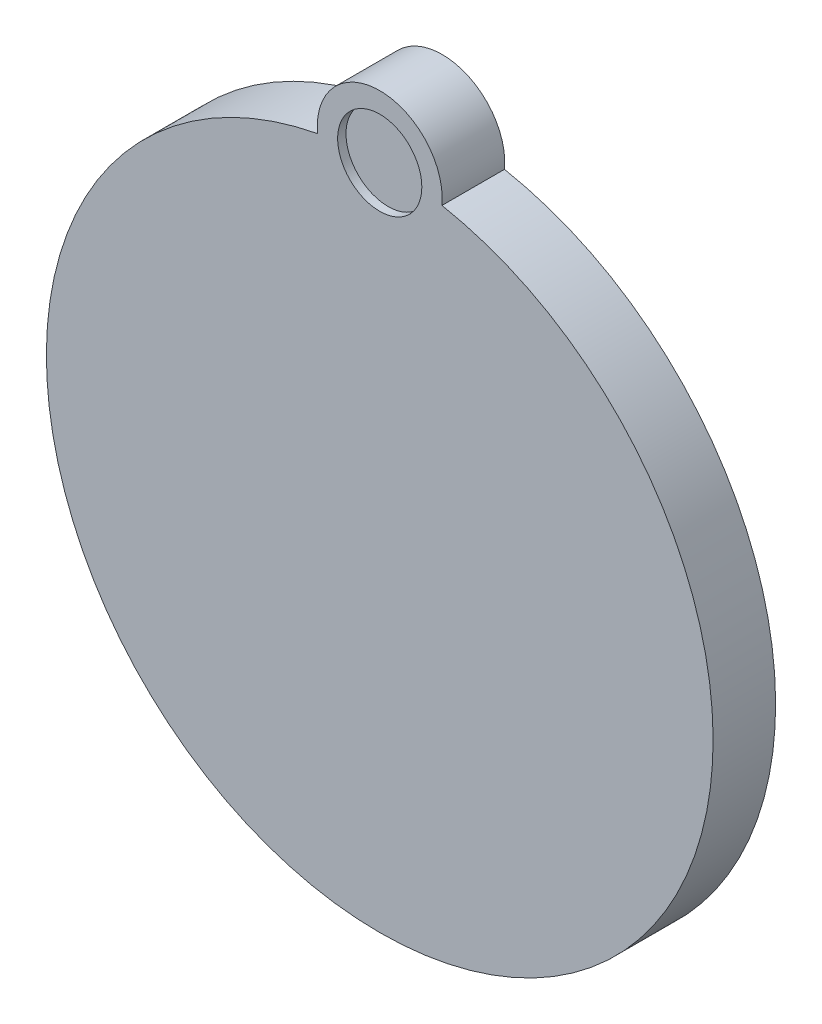
ISO-10303-21;
HEADER;
FILE_DESCRIPTION(('STEP AP214'),'2;1');
FILE_NAME('part.step','',(''),(''),'','','');
FILE_SCHEMA(('AUTOMOTIVE_DESIGN { 1 0 10303 214 1 1 1 1 }'));
ENDSEC;
DATA;
#1=APPLICATION_CONTEXT('core data for automotive mechanical design processes');
#2=APPLICATION_PROTOCOL_DEFINITION('international standard','automotive_design',2000,#1);
#3=PRODUCT_CONTEXT('',#1,'mechanical');
#4=PRODUCT('Part','Part','',(#3));
#5=PRODUCT_RELATED_PRODUCT_CATEGORY('part','',(#4));
#6=PRODUCT_DEFINITION_FORMATION('','',#4);
#7=PRODUCT_DEFINITION_CONTEXT('part definition',#1,'design');
#8=PRODUCT_DEFINITION('design','',#6,#7);
#9=PRODUCT_DEFINITION_SHAPE('','',#8);
#10=(LENGTH_UNIT() NAMED_UNIT(*) SI_UNIT(.MILLI.,.METRE.));
#11=(NAMED_UNIT(*) PLANE_ANGLE_UNIT() SI_UNIT($,.RADIAN.));
#12=(NAMED_UNIT(*) SI_UNIT($,.STERADIAN.) SOLID_ANGLE_UNIT());
#13=UNCERTAINTY_MEASURE_WITH_UNIT(LENGTH_MEASURE(1.E-05),#10,'distance_accuracy_value','');
#14=(GEOMETRIC_REPRESENTATION_CONTEXT(3) GLOBAL_UNCERTAINTY_ASSIGNED_CONTEXT((#13)) GLOBAL_UNIT_ASSIGNED_CONTEXT((#10,
#11,#12)) REPRESENTATION_CONTEXT('',''));
#15=CARTESIAN_POINT('',(0.,0.,0.));
#16=DIRECTION('',(0.,0.,1.));
#17=DIRECTION('',(1.,0.,0.));
#18=AXIS2_PLACEMENT_3D('',#15,#16,#17);
#19=CARTESIAN_POINT('',(0.,-80.,15.));
#20=DIRECTION('',(0.,0.,-1.));
#21=DIRECTION('',(-1.,0.,0.));
#22=AXIS2_PLACEMENT_3D('',#19,#20,#21);
#23=CYLINDRICAL_SURFACE('',#22,80.);
#24=CARTESIAN_POINT('',(0.,-80.,0.));
#25=DIRECTION('',(0.,0.,1.));
#26=DIRECTION('',(1.,0.,0.));
#27=AXIS2_PLACEMENT_3D('',#24,#25,#26);
#28=CIRCLE('',#27,80.);
#29=CARTESIAN_POINT('',(-14.9339365519444,-1.40625,0.));
#30=VERTEX_POINT('',#29);
#31=CARTESIAN_POINT('',(14.9339365519444,-1.40625000000001,0.));
#32=VERTEX_POINT('',#31);
#33=EDGE_CURVE('E64',#30,#32,#28,.T.);
#34=ORIENTED_EDGE('',*,*,#33,.T.);
#35=DIRECTION('',(0.,0.,-1.));
#36=VECTOR('',#35,1.);
#37=CARTESIAN_POINT('',(14.9339365519444,-1.40625000000001,15.));
#38=LINE('',#37,#36);
#39=CARTESIAN_POINT('',(14.9339365519444,-1.40625000000001,15.));
#40=VERTEX_POINT('',#39);
#41=EDGE_CURVE('E11',#40,#32,#38,.T.);
#42=ORIENTED_EDGE('',*,*,#41,.F.);
#43=CARTESIAN_POINT('',(0.,-80.,15.));
#44=DIRECTION('',(0.,0.,1.));
#45=DIRECTION('',(1.,0.,0.));
#46=AXIS2_PLACEMENT_3D('',#43,#44,#45);
#47=CIRCLE('',#46,80.);
#48=CARTESIAN_POINT('',(-14.9339365519444,-1.40625,15.));
#49=VERTEX_POINT('',#48);
#50=EDGE_CURVE('E63',#49,#40,#47,.T.);
#51=ORIENTED_EDGE('',*,*,#50,.F.);
#52=DIRECTION('',(0.,0.,-1.));
#53=VECTOR('',#52,1.);
#54=CARTESIAN_POINT('',(-14.9339365519444,-1.40625,15.));
#55=LINE('',#54,#53);
#56=EDGE_CURVE('E41',#49,#30,#55,.T.);
#57=ORIENTED_EDGE('',*,*,#56,.T.);
#58=EDGE_LOOP('',(#34,#42,#51,#57));
#59=FACE_BOUND('',#58,.T.);
#60=ADVANCED_FACE('F33',(#59),#23,.T.);
#61=CARTESIAN_POINT('',(0.,0.,15.));
#62=DIRECTION('',(0.,0.,-1.));
#63=DIRECTION('',(-1.,0.,0.));
#64=AXIS2_PLACEMENT_3D('',#61,#62,#63);
#65=CYLINDRICAL_SURFACE('',#64,15.);
#66=CARTESIAN_POINT('',(0.,0.,0.));
#67=DIRECTION('',(0.,0.,1.));
#68=DIRECTION('',(1.,0.,0.));
#69=AXIS2_PLACEMENT_3D('',#66,#67,#68);
#70=CIRCLE('',#69,15.);
#71=EDGE_CURVE('E56',#32,#30,#70,.T.);
#72=ORIENTED_EDGE('',*,*,#71,.T.);
#73=ORIENTED_EDGE('',*,*,#56,.F.);
#74=CARTESIAN_POINT('',(0.,0.,15.));
#75=DIRECTION('',(0.,0.,1.));
#76=DIRECTION('',(1.,0.,0.));
#77=AXIS2_PLACEMENT_3D('',#74,#75,#76);
#78=CIRCLE('',#77,15.);
#79=EDGE_CURVE('E48',#40,#49,#78,.T.);
#80=ORIENTED_EDGE('',*,*,#79,.F.);
#81=ORIENTED_EDGE('',*,*,#41,.T.);
#82=EDGE_LOOP('',(#72,#73,#80,#81));
#83=FACE_BOUND('',#82,.T.);
#84=ADVANCED_FACE('F59',(#83),#65,.T.);
#85=CARTESIAN_POINT('',(0.,0.,15.));
#86=DIRECTION('',(0.,0.,1.));
#87=DIRECTION('',(1.,0.,0.));
#88=AXIS2_PLACEMENT_3D('',#85,#86,#87);
#89=PLANE('',#88);
#90=CARTESIAN_POINT('',(0.,0.,15.));
#91=DIRECTION('',(0.,0.,1.));
#92=DIRECTION('',(1.,0.,0.));
#93=AXIS2_PLACEMENT_3D('',#90,#91,#92);
#94=CIRCLE('',#93,10.1);
#95=CARTESIAN_POINT('',(10.1,0.,15.));
#96=VERTEX_POINT('',#95);
#97=EDGE_CURVE('E71',#96,#96,#94,.T.);
#98=ORIENTED_EDGE('',*,*,#97,.F.);
#99=EDGE_LOOP('',(#98));
#100=FACE_BOUND('',#99,.T.);
#101=ORIENTED_EDGE('',*,*,#50,.T.);
#102=ORIENTED_EDGE('',*,*,#79,.T.);
#103=EDGE_LOOP('',(#101,#102));
#104=FACE_BOUND('',#103,.T.);
#105=ADVANCED_FACE('F81',(#100,#104),#89,.T.);
#106=CARTESIAN_POINT('',(0.,0.,0.));
#107=DIRECTION('',(0.,0.,1.));
#108=DIRECTION('',(1.,0.,0.));
#109=AXIS2_PLACEMENT_3D('',#106,#107,#108);
#110=PLANE('',#109);
#111=ORIENTED_EDGE('',*,*,#33,.F.);
#112=ORIENTED_EDGE('',*,*,#71,.F.);
#113=EDGE_LOOP('',(#111,#112));
#114=FACE_BOUND('',#113,.T.);
#115=ADVANCED_FACE('F67',(#114),#110,.F.);
#116=CARTESIAN_POINT('',(0.,0.,13.));
#117=DIRECTION('',(0.,0.,1.));
#118=DIRECTION('',(1.,0.,0.));
#119=AXIS2_PLACEMENT_3D('',#116,#117,#118);
#120=CYLINDRICAL_SURFACE('',#119,10.1);
#121=CARTESIAN_POINT('',(0.,0.,13.));
#122=DIRECTION('',(0.,0.,1.));
#123=DIRECTION('',(1.,0.,0.));
#124=AXIS2_PLACEMENT_3D('',#121,#122,#123);
#125=CIRCLE('',#124,10.1);
#126=CARTESIAN_POINT('',(10.1,0.,13.));
#127=VERTEX_POINT('',#126);
#128=EDGE_CURVE('E68',#127,#127,#125,.T.);
#129=ORIENTED_EDGE('',*,*,#128,.F.);
#130=EDGE_LOOP('',(#129));
#131=FACE_BOUND('',#130,.T.);
#132=ORIENTED_EDGE('',*,*,#97,.T.);
#133=EDGE_LOOP('',(#132));
#134=FACE_BOUND('',#133,.T.);
#135=ADVANCED_FACE('F79',(#131,#134),#120,.F.);
#136=CARTESIAN_POINT('',(0.,0.,13.));
#137=DIRECTION('',(0.,0.,1.));
#138=DIRECTION('',(1.,0.,0.));
#139=AXIS2_PLACEMENT_3D('',#136,#137,#138);
#140=PLANE('',#139);
#141=ORIENTED_EDGE('',*,*,#128,.T.);
#142=EDGE_LOOP('',(#141));
#143=FACE_BOUND('',#142,.T.);
#144=ADVANCED_FACE('F111',(#143),#140,.T.);
#145=CLOSED_SHELL('',(#60,#84,#105,#115,#135,#144));
#146=MANIFOLD_SOLID_BREP('B2',#145);
#147=ADVANCED_BREP_SHAPE_REPRESENTATION('',(#18,#146),#14);
#148=SHAPE_DEFINITION_REPRESENTATION(#9,#147);
ENDSEC;
END-ISO-10303-21;
